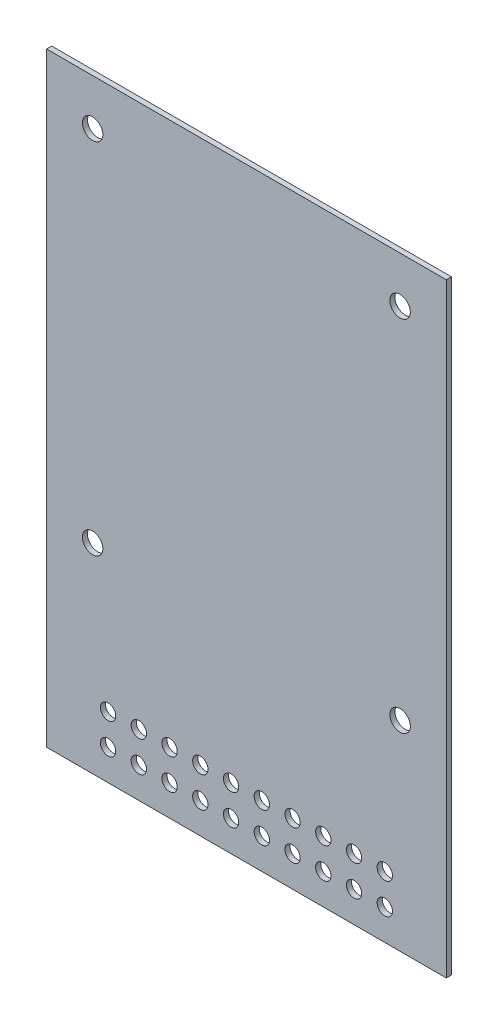
ISO-10303-21;
HEADER;
FILE_DESCRIPTION(('STEP AP214'),'2;1');
FILE_NAME('part.step','',(''),(''),'','','');
FILE_SCHEMA(('AUTOMOTIVE_DESIGN { 1 0 10303 214 1 1 1 1 }'));
ENDSEC;
DATA;
#1=APPLICATION_CONTEXT('core data for automotive mechanical design processes');
#2=APPLICATION_PROTOCOL_DEFINITION('international standard','automotive_design',2000,#1);
#3=PRODUCT_CONTEXT('',#1,'mechanical');
#4=PRODUCT('Part','Part','',(#3));
#5=PRODUCT_RELATED_PRODUCT_CATEGORY('part','',(#4));
#6=PRODUCT_DEFINITION_FORMATION('','',#4);
#7=PRODUCT_DEFINITION_CONTEXT('part definition',#1,'design');
#8=PRODUCT_DEFINITION('design','',#6,#7);
#9=PRODUCT_DEFINITION_SHAPE('','',#8);
#10=(LENGTH_UNIT() NAMED_UNIT(*) SI_UNIT(.MILLI.,.METRE.));
#11=(NAMED_UNIT(*) PLANE_ANGLE_UNIT() SI_UNIT($,.RADIAN.));
#12=(NAMED_UNIT(*) SI_UNIT($,.STERADIAN.) SOLID_ANGLE_UNIT());
#13=UNCERTAINTY_MEASURE_WITH_UNIT(LENGTH_MEASURE(1.E-05),#10,'distance_accuracy_value','');
#14=(GEOMETRIC_REPRESENTATION_CONTEXT(3) GLOBAL_UNCERTAINTY_ASSIGNED_CONTEXT((#13)) GLOBAL_UNIT_ASSIGNED_CONTEXT((#10,
#11,#12)) REPRESENTATION_CONTEXT('',''));
#15=CARTESIAN_POINT('',(0.,0.,0.));
#16=DIRECTION('',(0.,0.,1.));
#17=DIRECTION('',(1.,0.,0.));
#18=AXIS2_PLACEMENT_3D('',#15,#16,#17);
#19=CARTESIAN_POINT('',(0.,0.,1.));
#20=DIRECTION('',(1.,0.,0.));
#21=DIRECTION('',(0.,0.,-1.));
#22=AXIS2_PLACEMENT_3D('',#19,#20,#21);
#23=PLANE('',#22);
#24=DIRECTION('',(0.,-1.,0.));
#25=VECTOR('',#24,1.);
#26=CARTESIAN_POINT('',(0.,0.,0.));
#27=LINE('',#26,#25);
#28=CARTESIAN_POINT('',(0.,118.,0.));
#29=VERTEX_POINT('',#28);
#30=CARTESIAN_POINT('',(0.,0.,0.));
#31=VERTEX_POINT('',#30);
#32=EDGE_CURVE('E95',#29,#31,#27,.T.);
#33=ORIENTED_EDGE('',*,*,#32,.T.);
#34=DIRECTION('',(0.,0.,-1.));
#35=VECTOR('',#34,1.);
#36=CARTESIAN_POINT('',(0.,0.,1.));
#37=LINE('',#36,#35);
#38=CARTESIAN_POINT('',(0.,0.,1.));
#39=VERTEX_POINT('',#38);
#40=EDGE_CURVE('E11',#39,#31,#37,.T.);
#41=ORIENTED_EDGE('',*,*,#40,.F.);
#42=DIRECTION('',(0.,-1.,0.));
#43=VECTOR('',#42,1.);
#44=CARTESIAN_POINT('',(0.,0.,1.));
#45=LINE('',#44,#43);
#46=CARTESIAN_POINT('',(0.,118.,1.));
#47=VERTEX_POINT('',#46);
#48=EDGE_CURVE('E83',#47,#39,#45,.T.);
#49=ORIENTED_EDGE('',*,*,#48,.F.);
#50=DIRECTION('',(0.,0.,-1.));
#51=VECTOR('',#50,1.);
#52=CARTESIAN_POINT('',(0.,118.,1.));
#53=LINE('',#52,#51);
#54=EDGE_CURVE('E91',#47,#29,#53,.T.);
#55=ORIENTED_EDGE('',*,*,#54,.T.);
#56=EDGE_LOOP('',(#33,#41,#49,#55));
#57=FACE_BOUND('',#56,.T.);
#58=ADVANCED_FACE('F32',(#57),#23,.F.);
#59=CARTESIAN_POINT('',(0.,0.,1.));
#60=DIRECTION('',(0.,1.,0.));
#61=DIRECTION('',(0.,0.,1.));
#62=AXIS2_PLACEMENT_3D('',#59,#60,#61);
#63=PLANE('',#62);
#64=DIRECTION('',(1.,0.,0.));
#65=VECTOR('',#64,1.);
#66=CARTESIAN_POINT('',(0.,0.,0.));
#67=LINE('',#66,#65);
#68=CARTESIAN_POINT('',(78.,0.,0.));
#69=VERTEX_POINT('',#68);
#70=EDGE_CURVE('E87',#31,#69,#67,.T.);
#71=ORIENTED_EDGE('',*,*,#70,.T.);
#72=DIRECTION('',(0.,0.,-1.));
#73=VECTOR('',#72,1.);
#74=CARTESIAN_POINT('',(78.,0.,1.));
#75=LINE('',#74,#73);
#76=CARTESIAN_POINT('',(78.,0.,1.));
#77=VERTEX_POINT('',#76);
#78=EDGE_CURVE('E40',#77,#69,#75,.T.);
#79=ORIENTED_EDGE('',*,*,#78,.F.);
#80=DIRECTION('',(1.,0.,0.));
#81=VECTOR('',#80,1.);
#82=CARTESIAN_POINT('',(0.,0.,1.));
#83=LINE('',#82,#81);
#84=EDGE_CURVE('E78',#39,#77,#83,.T.);
#85=ORIENTED_EDGE('',*,*,#84,.F.);
#86=ORIENTED_EDGE('',*,*,#40,.T.);
#87=EDGE_LOOP('',(#71,#79,#85,#86));
#88=FACE_BOUND('',#87,.T.);
#89=ADVANCED_FACE('F86',(#88),#63,.F.);
#90=CARTESIAN_POINT('',(78.,0.,1.));
#91=DIRECTION('',(-1.,0.,0.));
#92=DIRECTION('',(0.,0.,1.));
#93=AXIS2_PLACEMENT_3D('',#90,#91,#92);
#94=PLANE('',#93);
#95=DIRECTION('',(0.,1.,0.));
#96=VECTOR('',#95,1.);
#97=CARTESIAN_POINT('',(78.,0.,0.));
#98=LINE('',#97,#96);
#99=CARTESIAN_POINT('',(78.,118.,0.));
#100=VERTEX_POINT('',#99);
#101=EDGE_CURVE('E65',#69,#100,#98,.T.);
#102=ORIENTED_EDGE('',*,*,#101,.T.);
#103=DIRECTION('',(0.,0.,-1.));
#104=VECTOR('',#103,1.);
#105=CARTESIAN_POINT('',(78.,118.,1.));
#106=LINE('',#105,#104);
#107=CARTESIAN_POINT('',(78.,118.,1.));
#108=VERTEX_POINT('',#107);
#109=EDGE_CURVE('E88',#108,#100,#106,.T.);
#110=ORIENTED_EDGE('',*,*,#109,.F.);
#111=DIRECTION('',(0.,1.,0.));
#112=VECTOR('',#111,1.);
#113=CARTESIAN_POINT('',(78.,0.,1.));
#114=LINE('',#113,#112);
#115=EDGE_CURVE('E81',#77,#108,#114,.T.);
#116=ORIENTED_EDGE('',*,*,#115,.F.);
#117=ORIENTED_EDGE('',*,*,#78,.T.);
#118=EDGE_LOOP('',(#102,#110,#116,#117));
#119=FACE_BOUND('',#118,.T.);
#120=ADVANCED_FACE('F89',(#119),#94,.F.);
#121=CARTESIAN_POINT('',(0.,118.,1.));
#122=DIRECTION('',(0.,-1.,0.));
#123=DIRECTION('',(0.,0.,-1.));
#124=AXIS2_PLACEMENT_3D('',#121,#122,#123);
#125=PLANE('',#124);
#126=DIRECTION('',(-1.,0.,0.));
#127=VECTOR('',#126,1.);
#128=CARTESIAN_POINT('',(0.,118.,0.));
#129=LINE('',#128,#127);
#130=EDGE_CURVE('E71',#100,#29,#129,.T.);
#131=ORIENTED_EDGE('',*,*,#130,.T.);
#132=ORIENTED_EDGE('',*,*,#54,.F.);
#133=DIRECTION('',(-1.,0.,0.));
#134=VECTOR('',#133,1.);
#135=CARTESIAN_POINT('',(0.,118.,1.));
#136=LINE('',#135,#134);
#137=EDGE_CURVE('E48',#108,#47,#136,.T.);
#138=ORIENTED_EDGE('',*,*,#137,.F.);
#139=ORIENTED_EDGE('',*,*,#109,.T.);
#140=EDGE_LOOP('',(#131,#132,#138,#139));
#141=FACE_BOUND('',#140,.T.);
#142=ADVANCED_FACE('F103',(#141),#125,.F.);
#143=CARTESIAN_POINT('',(0.,0.,1.));
#144=DIRECTION('',(0.,0.,-1.));
#145=DIRECTION('',(-1.,0.,0.));
#146=AXIS2_PLACEMENT_3D('',#143,#144,#145);
#147=PLANE('',#146);
#148=CARTESIAN_POINT('',(42.,6.,1.));
#149=DIRECTION('',(0.,0.,-1.));
#150=DIRECTION('',(-1.,0.,0.));
#151=AXIS2_PLACEMENT_3D('',#148,#149,#150);
#152=CIRCLE('',#151,1.5);
#153=CARTESIAN_POINT('',(40.4999999999999,6.,1.));
#154=VERTEX_POINT('',#153);
#155=EDGE_CURVE('E202',#154,#154,#152,.T.);
#156=ORIENTED_EDGE('',*,*,#155,.T.);
#157=EDGE_LOOP('',(#156));
#158=FACE_BOUND('',#157,.T.);
#159=CARTESIAN_POINT('',(47.9999999999999,6.,1.));
#160=DIRECTION('',(0.,0.,-1.));
#161=DIRECTION('',(-1.,0.,0.));
#162=AXIS2_PLACEMENT_3D('',#159,#160,#161);
#163=CIRCLE('',#162,1.5);
#164=CARTESIAN_POINT('',(46.4999999999999,6.,1.));
#165=VERTEX_POINT('',#164);
#166=EDGE_CURVE('E209',#165,#165,#163,.T.);
#167=ORIENTED_EDGE('',*,*,#166,.T.);
#168=EDGE_LOOP('',(#167));
#169=FACE_BOUND('',#168,.T.);
#170=CARTESIAN_POINT('',(53.9999999999999,6.,1.));
#171=DIRECTION('',(0.,0.,-1.));
#172=DIRECTION('',(-1.,0.,0.));
#173=AXIS2_PLACEMENT_3D('',#170,#171,#172);
#174=CIRCLE('',#173,1.50000000000001);
#175=CARTESIAN_POINT('',(52.4999999999999,6.,1.));
#176=VERTEX_POINT('',#175);
#177=EDGE_CURVE('E191',#176,#176,#174,.T.);
#178=ORIENTED_EDGE('',*,*,#177,.T.);
#179=EDGE_LOOP('',(#178));
#180=FACE_BOUND('',#179,.T.);
#181=CARTESIAN_POINT('',(18.,12.,1.));
#182=DIRECTION('',(0.,0.,-1.));
#183=DIRECTION('',(-1.,0.,0.));
#184=AXIS2_PLACEMENT_3D('',#181,#182,#183);
#185=CIRCLE('',#184,1.5);
#186=CARTESIAN_POINT('',(16.5,12.,1.));
#187=VERTEX_POINT('',#186);
#188=EDGE_CURVE('E149',#187,#187,#185,.T.);
#189=ORIENTED_EDGE('',*,*,#188,.T.);
#190=EDGE_LOOP('',(#189));
#191=FACE_BOUND('',#190,.T.);
#192=CARTESIAN_POINT('',(12.,12.,1.));
#193=DIRECTION('',(0.,0.,-1.));
#194=DIRECTION('',(-1.,0.,0.));
#195=AXIS2_PLACEMENT_3D('',#192,#193,#194);
#196=CIRCLE('',#195,1.5);
#197=CARTESIAN_POINT('',(10.5,12.,1.));
#198=VERTEX_POINT('',#197);
#199=EDGE_CURVE('E184',#198,#198,#196,.T.);
#200=ORIENTED_EDGE('',*,*,#199,.T.);
#201=EDGE_LOOP('',(#200));
#202=FACE_BOUND('',#201,.T.);
#203=CARTESIAN_POINT('',(59.9999999999999,6.,1.));
#204=DIRECTION('',(0.,0.,-1.));
#205=DIRECTION('',(-1.,0.,0.));
#206=AXIS2_PLACEMENT_3D('',#203,#204,#205);
#207=CIRCLE('',#206,1.5);
#208=CARTESIAN_POINT('',(58.4999999999999,6.,1.));
#209=VERTEX_POINT('',#208);
#210=EDGE_CURVE('E190',#209,#209,#207,.T.);
#211=ORIENTED_EDGE('',*,*,#210,.T.);
#212=EDGE_LOOP('',(#211));
#213=FACE_BOUND('',#212,.T.);
#214=CARTESIAN_POINT('',(18.,6.,1.));
#215=DIRECTION('',(0.,0.,-1.));
#216=DIRECTION('',(-1.,0.,0.));
#217=AXIS2_PLACEMENT_3D('',#214,#215,#216);
#218=CIRCLE('',#217,1.5);
#219=CARTESIAN_POINT('',(16.5,6.,1.));
#220=VERTEX_POINT('',#219);
#221=EDGE_CURVE('E221',#220,#220,#218,.T.);
#222=ORIENTED_EDGE('',*,*,#221,.T.);
#223=EDGE_LOOP('',(#222));
#224=FACE_BOUND('',#223,.T.);
#225=CARTESIAN_POINT('',(12.,6.,1.));
#226=DIRECTION('',(0.,0.,-1.));
#227=DIRECTION('',(-1.,0.,0.));
#228=AXIS2_PLACEMENT_3D('',#225,#226,#227);
#229=CIRCLE('',#228,1.5);
#230=CARTESIAN_POINT('',(10.5,6.,1.));
#231=VERTEX_POINT('',#230);
#232=EDGE_CURVE('E238',#231,#231,#229,.T.);
#233=ORIENTED_EDGE('',*,*,#232,.T.);
#234=EDGE_LOOP('',(#233));
#235=FACE_BOUND('',#234,.T.);
#236=CARTESIAN_POINT('',(65.9999999999999,6.,1.));
#237=DIRECTION('',(0.,0.,-1.));
#238=DIRECTION('',(-1.,0.,0.));
#239=AXIS2_PLACEMENT_3D('',#236,#237,#238);
#240=CIRCLE('',#239,1.5);
#241=CARTESIAN_POINT('',(64.4999999999999,6.,1.));
#242=VERTEX_POINT('',#241);
#243=EDGE_CURVE('E244',#242,#242,#240,.T.);
#244=ORIENTED_EDGE('',*,*,#243,.T.);
#245=EDGE_LOOP('',(#244));
#246=FACE_BOUND('',#245,.T.);
#247=CARTESIAN_POINT('',(24.,6.,1.));
#248=DIRECTION('',(0.,0.,-1.));
#249=DIRECTION('',(-1.,0.,0.));
#250=AXIS2_PLACEMENT_3D('',#247,#248,#249);
#251=CIRCLE('',#250,1.5);
#252=CARTESIAN_POINT('',(22.4999999999999,6.,1.));
#253=VERTEX_POINT('',#252);
#254=EDGE_CURVE('E220',#253,#253,#251,.T.);
#255=ORIENTED_EDGE('',*,*,#254,.T.);
#256=EDGE_LOOP('',(#255));
#257=FACE_BOUND('',#256,.T.);
#258=CARTESIAN_POINT('',(30.,6.,1.));
#259=DIRECTION('',(0.,0.,-1.));
#260=DIRECTION('',(-1.,0.,0.));
#261=AXIS2_PLACEMENT_3D('',#258,#259,#260);
#262=CIRCLE('',#261,1.5);
#263=CARTESIAN_POINT('',(28.4999999999999,6.,1.));
#264=VERTEX_POINT('',#263);
#265=EDGE_CURVE('E227',#264,#264,#262,.T.);
#266=ORIENTED_EDGE('',*,*,#265,.T.);
#267=EDGE_LOOP('',(#266));
#268=FACE_BOUND('',#267,.T.);
#269=CARTESIAN_POINT('',(36.,6.,1.));
#270=DIRECTION('',(0.,0.,-1.));
#271=DIRECTION('',(-1.,0.,0.));
#272=AXIS2_PLACEMENT_3D('',#269,#270,#271);
#273=CIRCLE('',#272,1.5);
#274=CARTESIAN_POINT('',(34.5,6.,1.));
#275=VERTEX_POINT('',#274);
#276=EDGE_CURVE('E203',#275,#275,#273,.T.);
#277=ORIENTED_EDGE('',*,*,#276,.T.);
#278=EDGE_LOOP('',(#277));
#279=FACE_BOUND('',#278,.T.);
#280=CARTESIAN_POINT('',(60.,12.,1.));
#281=DIRECTION('',(0.,0.,-1.));
#282=DIRECTION('',(-1.,0.,0.));
#283=AXIS2_PLACEMENT_3D('',#280,#281,#282);
#284=CIRCLE('',#283,1.5);
#285=CARTESIAN_POINT('',(58.5,12.,1.));
#286=VERTEX_POINT('',#285);
#287=EDGE_CURVE('E130',#286,#286,#284,.T.);
#288=ORIENTED_EDGE('',*,*,#287,.T.);
#289=EDGE_LOOP('',(#288));
#290=FACE_BOUND('',#289,.T.);
#291=CARTESIAN_POINT('',(8.98039304889869,109.016810722607,1.));
#292=DIRECTION('',(0.,0.,-1.));
#293=DIRECTION('',(-1.,0.,0.));
#294=AXIS2_PLACEMENT_3D('',#291,#292,#293);
#295=CIRCLE('',#294,2.);
#296=CARTESIAN_POINT('',(6.98039304889868,109.016810722607,1.));
#297=VERTEX_POINT('',#296);
#298=EDGE_CURVE('E137',#297,#297,#295,.T.);
#299=ORIENTED_EDGE('',*,*,#298,.T.);
#300=EDGE_LOOP('',(#299));
#301=FACE_BOUND('',#300,.T.);
#302=CARTESIAN_POINT('',(68.9803930488987,109.016810722607,1.));
#303=DIRECTION('',(0.,0.,-1.));
#304=DIRECTION('',(-1.,0.,0.));
#305=AXIS2_PLACEMENT_3D('',#302,#303,#304);
#306=CIRCLE('',#305,2.);
#307=CARTESIAN_POINT('',(66.9803930488987,109.016810722607,1.));
#308=VERTEX_POINT('',#307);
#309=EDGE_CURVE('E119',#308,#308,#306,.T.);
#310=ORIENTED_EDGE('',*,*,#309,.T.);
#311=EDGE_LOOP('',(#310));
#312=FACE_BOUND('',#311,.T.);
#313=CARTESIAN_POINT('',(68.9803930488984,39.0168107226069,1.));
#314=DIRECTION('',(0.,0.,-1.));
#315=DIRECTION('',(-1.,0.,0.));
#316=AXIS2_PLACEMENT_3D('',#313,#314,#315);
#317=CIRCLE('',#316,2.00000000000001);
#318=CARTESIAN_POINT('',(66.9803930488984,39.0168107226069,1.));
#319=VERTEX_POINT('',#318);
#320=EDGE_CURVE('E118',#319,#319,#317,.T.);
#321=ORIENTED_EDGE('',*,*,#320,.T.);
#322=EDGE_LOOP('',(#321));
#323=FACE_BOUND('',#322,.T.);
#324=CARTESIAN_POINT('',(66.,12.,1.));
#325=DIRECTION('',(0.,0.,-1.));
#326=DIRECTION('',(-1.,0.,0.));
#327=AXIS2_PLACEMENT_3D('',#324,#325,#326);
#328=CIRCLE('',#327,1.5);
#329=CARTESIAN_POINT('',(64.5,12.,1.));
#330=VERTEX_POINT('',#329);
#331=EDGE_CURVE('E112',#330,#330,#328,.T.);
#332=ORIENTED_EDGE('',*,*,#331,.T.);
#333=EDGE_LOOP('',(#332));
#334=FACE_BOUND('',#333,.T.);
#335=CARTESIAN_POINT('',(54.,12.,1.));
#336=DIRECTION('',(0.,0.,-1.));
#337=DIRECTION('',(-1.,0.,0.));
#338=AXIS2_PLACEMENT_3D('',#335,#336,#337);
#339=CIRCLE('',#338,1.5);
#340=CARTESIAN_POINT('',(52.5,12.,1.));
#341=VERTEX_POINT('',#340);
#342=EDGE_CURVE('E131',#341,#341,#339,.T.);
#343=ORIENTED_EDGE('',*,*,#342,.T.);
#344=EDGE_LOOP('',(#343));
#345=FACE_BOUND('',#344,.T.);
#346=CARTESIAN_POINT('',(48.,12.,1.));
#347=DIRECTION('',(0.,0.,-1.));
#348=DIRECTION('',(-1.,0.,0.));
#349=AXIS2_PLACEMENT_3D('',#346,#347,#348);
#350=CIRCLE('',#349,1.5);
#351=CARTESIAN_POINT('',(46.5,12.,1.));
#352=VERTEX_POINT('',#351);
#353=EDGE_CURVE('E173',#352,#352,#350,.T.);
#354=ORIENTED_EDGE('',*,*,#353,.T.);
#355=EDGE_LOOP('',(#354));
#356=FACE_BOUND('',#355,.T.);
#357=CARTESIAN_POINT('',(42.,12.,1.));
#358=DIRECTION('',(0.,0.,-1.));
#359=DIRECTION('',(-1.,0.,0.));
#360=AXIS2_PLACEMENT_3D('',#357,#358,#359);
#361=CIRCLE('',#360,1.5);
#362=CARTESIAN_POINT('',(40.5,12.,1.));
#363=VERTEX_POINT('',#362);
#364=EDGE_CURVE('E167',#363,#363,#361,.T.);
#365=ORIENTED_EDGE('',*,*,#364,.T.);
#366=EDGE_LOOP('',(#365));
#367=FACE_BOUND('',#366,.T.);
#368=CARTESIAN_POINT('',(36.,12.,1.));
#369=DIRECTION('',(0.,0.,-1.));
#370=DIRECTION('',(-1.,0.,0.));
#371=AXIS2_PLACEMENT_3D('',#368,#369,#370);
#372=CIRCLE('',#371,1.5);
#373=CARTESIAN_POINT('',(34.5,12.,1.));
#374=VERTEX_POINT('',#373);
#375=EDGE_CURVE('E161',#374,#374,#372,.T.);
#376=ORIENTED_EDGE('',*,*,#375,.T.);
#377=EDGE_LOOP('',(#376));
#378=FACE_BOUND('',#377,.T.);
#379=CARTESIAN_POINT('',(30.,12.,1.));
#380=DIRECTION('',(0.,0.,-1.));
#381=DIRECTION('',(-1.,0.,0.));
#382=AXIS2_PLACEMENT_3D('',#379,#380,#381);
#383=CIRCLE('',#382,1.5);
#384=CARTESIAN_POINT('',(28.5,12.,1.));
#385=VERTEX_POINT('',#384);
#386=EDGE_CURVE('E155',#385,#385,#383,.T.);
#387=ORIENTED_EDGE('',*,*,#386,.T.);
#388=EDGE_LOOP('',(#387));
#389=FACE_BOUND('',#388,.T.);
#390=CARTESIAN_POINT('',(24.,12.,1.));
#391=DIRECTION('',(0.,0.,-1.));
#392=DIRECTION('',(-1.,0.,0.));
#393=AXIS2_PLACEMENT_3D('',#390,#391,#392);
#394=CIRCLE('',#393,1.5);
#395=CARTESIAN_POINT('',(22.5,12.,1.));
#396=VERTEX_POINT('',#395);
#397=EDGE_CURVE('E148',#396,#396,#394,.T.);
#398=ORIENTED_EDGE('',*,*,#397,.T.);
#399=EDGE_LOOP('',(#398));
#400=FACE_BOUND('',#399,.T.);
#401=CARTESIAN_POINT('',(8.98039304889844,39.0168107226073,1.));
#402=DIRECTION('',(0.,0.,-1.));
#403=DIRECTION('',(-1.,0.,0.));
#404=AXIS2_PLACEMENT_3D('',#401,#402,#403);
#405=CIRCLE('',#404,2.);
#406=CARTESIAN_POINT('',(6.98039304889844,39.0168107226073,1.));
#407=VERTEX_POINT('',#406);
#408=EDGE_CURVE('E98',#407,#407,#405,.T.);
#409=ORIENTED_EDGE('',*,*,#408,.T.);
#410=EDGE_LOOP('',(#409));
#411=FACE_BOUND('',#410,.T.);
#412=ORIENTED_EDGE('',*,*,#48,.T.);
#413=ORIENTED_EDGE('',*,*,#84,.T.);
#414=ORIENTED_EDGE('',*,*,#115,.T.);
#415=ORIENTED_EDGE('',*,*,#137,.T.);
#416=EDGE_LOOP('',(#412,#413,#414,#415));
#417=FACE_BOUND('',#416,.T.);
#418=ADVANCED_FACE('F79',(#158,#169,#180,#191,#202,#213,#224,#235,#246,#257,#268,#279,#290,#301,
#312,#323,#334,#345,#356,#367,#378,#389,#400,#411,#417),#147,.F.);
#419=CARTESIAN_POINT('',(0.,0.,0.));
#420=DIRECTION('',(0.,0.,-1.));
#421=DIRECTION('',(-1.,0.,0.));
#422=AXIS2_PLACEMENT_3D('',#419,#420,#421);
#423=PLANE('',#422);
#424=CARTESIAN_POINT('',(42.,6.,0.));
#425=DIRECTION('',(0.,0.,-1.));
#426=DIRECTION('',(-1.,0.,0.));
#427=AXIS2_PLACEMENT_3D('',#424,#425,#426);
#428=CIRCLE('',#427,1.5);
#429=CARTESIAN_POINT('',(40.4999999999999,6.,0.));
#430=VERTEX_POINT('',#429);
#431=EDGE_CURVE('E199',#430,#430,#428,.T.);
#432=ORIENTED_EDGE('',*,*,#431,.F.);
#433=EDGE_LOOP('',(#432));
#434=FACE_BOUND('',#433,.T.);
#435=CARTESIAN_POINT('',(47.9999999999999,6.,0.));
#436=DIRECTION('',(0.,0.,-1.));
#437=DIRECTION('',(-1.,0.,0.));
#438=AXIS2_PLACEMENT_3D('',#435,#436,#437);
#439=CIRCLE('',#438,1.5);
#440=CARTESIAN_POINT('',(46.4999999999999,6.,0.));
#441=VERTEX_POINT('',#440);
#442=EDGE_CURVE('E206',#441,#441,#439,.T.);
#443=ORIENTED_EDGE('',*,*,#442,.F.);
#444=EDGE_LOOP('',(#443));
#445=FACE_BOUND('',#444,.T.);
#446=CARTESIAN_POINT('',(53.9999999999999,6.,0.));
#447=DIRECTION('',(0.,0.,-1.));
#448=DIRECTION('',(-1.,0.,0.));
#449=AXIS2_PLACEMENT_3D('',#446,#447,#448);
#450=CIRCLE('',#449,1.50000000000001);
#451=CARTESIAN_POINT('',(52.4999999999999,6.,0.));
#452=VERTEX_POINT('',#451);
#453=EDGE_CURVE('E212',#452,#452,#450,.T.);
#454=ORIENTED_EDGE('',*,*,#453,.F.);
#455=EDGE_LOOP('',(#454));
#456=FACE_BOUND('',#455,.T.);
#457=CARTESIAN_POINT('',(18.,12.,0.));
#458=DIRECTION('',(0.,0.,-1.));
#459=DIRECTION('',(-1.,0.,0.));
#460=AXIS2_PLACEMENT_3D('',#457,#458,#459);
#461=CIRCLE('',#460,1.5);
#462=CARTESIAN_POINT('',(16.5,12.,0.));
#463=VERTEX_POINT('',#462);
#464=EDGE_CURVE('E181',#463,#463,#461,.T.);
#465=ORIENTED_EDGE('',*,*,#464,.F.);
#466=EDGE_LOOP('',(#465));
#467=FACE_BOUND('',#466,.T.);
#468=CARTESIAN_POINT('',(12.,12.,0.));
#469=DIRECTION('',(0.,0.,-1.));
#470=DIRECTION('',(-1.,0.,0.));
#471=AXIS2_PLACEMENT_3D('',#468,#469,#470);
#472=CIRCLE('',#471,1.5);
#473=CARTESIAN_POINT('',(10.5,12.,0.));
#474=VERTEX_POINT('',#473);
#475=EDGE_CURVE('E194',#474,#474,#472,.T.);
#476=ORIENTED_EDGE('',*,*,#475,.F.);
#477=EDGE_LOOP('',(#476));
#478=FACE_BOUND('',#477,.T.);
#479=CARTESIAN_POINT('',(59.9999999999999,6.,0.));
#480=DIRECTION('',(0.,0.,-1.));
#481=DIRECTION('',(-1.,0.,0.));
#482=AXIS2_PLACEMENT_3D('',#479,#480,#481);
#483=CIRCLE('',#482,1.5);
#484=CARTESIAN_POINT('',(58.4999999999999,6.,0.));
#485=VERTEX_POINT('',#484);
#486=EDGE_CURVE('E187',#485,#485,#483,.T.);
#487=ORIENTED_EDGE('',*,*,#486,.F.);
#488=EDGE_LOOP('',(#487));
#489=FACE_BOUND('',#488,.T.);
#490=CARTESIAN_POINT('',(18.,6.,0.));
#491=DIRECTION('',(0.,0.,-1.));
#492=DIRECTION('',(-1.,0.,0.));
#493=AXIS2_PLACEMENT_3D('',#490,#491,#492);
#494=CIRCLE('',#493,1.5);
#495=CARTESIAN_POINT('',(16.5,6.,0.));
#496=VERTEX_POINT('',#495);
#497=EDGE_CURVE('E235',#496,#496,#494,.T.);
#498=ORIENTED_EDGE('',*,*,#497,.F.);
#499=EDGE_LOOP('',(#498));
#500=FACE_BOUND('',#499,.T.);
#501=CARTESIAN_POINT('',(12.,6.,0.));
#502=DIRECTION('',(0.,0.,-1.));
#503=DIRECTION('',(-1.,0.,0.));
#504=AXIS2_PLACEMENT_3D('',#501,#502,#503);
#505=CIRCLE('',#504,1.5);
#506=CARTESIAN_POINT('',(10.5,6.,0.));
#507=VERTEX_POINT('',#506);
#508=EDGE_CURVE('E247',#507,#507,#505,.T.);
#509=ORIENTED_EDGE('',*,*,#508,.F.);
#510=EDGE_LOOP('',(#509));
#511=FACE_BOUND('',#510,.T.);
#512=CARTESIAN_POINT('',(65.9999999999999,6.,0.));
#513=DIRECTION('',(0.,0.,-1.));
#514=DIRECTION('',(-1.,0.,0.));
#515=AXIS2_PLACEMENT_3D('',#512,#513,#514);
#516=CIRCLE('',#515,1.5);
#517=CARTESIAN_POINT('',(64.4999999999999,6.,0.));
#518=VERTEX_POINT('',#517);
#519=EDGE_CURVE('E241',#518,#518,#516,.T.);
#520=ORIENTED_EDGE('',*,*,#519,.F.);
#521=EDGE_LOOP('',(#520));
#522=FACE_BOUND('',#521,.T.);
#523=CARTESIAN_POINT('',(24.,6.,0.));
#524=DIRECTION('',(0.,0.,-1.));
#525=DIRECTION('',(-1.,0.,0.));
#526=AXIS2_PLACEMENT_3D('',#523,#524,#525);
#527=CIRCLE('',#526,1.5);
#528=CARTESIAN_POINT('',(22.4999999999999,6.,0.));
#529=VERTEX_POINT('',#528);
#530=EDGE_CURVE('E217',#529,#529,#527,.T.);
#531=ORIENTED_EDGE('',*,*,#530,.F.);
#532=EDGE_LOOP('',(#531));
#533=FACE_BOUND('',#532,.T.);
#534=CARTESIAN_POINT('',(30.,6.,0.));
#535=DIRECTION('',(0.,0.,-1.));
#536=DIRECTION('',(-1.,0.,0.));
#537=AXIS2_PLACEMENT_3D('',#534,#535,#536);
#538=CIRCLE('',#537,1.5);
#539=CARTESIAN_POINT('',(28.4999999999999,6.,0.));
#540=VERTEX_POINT('',#539);
#541=EDGE_CURVE('E224',#540,#540,#538,.T.);
#542=ORIENTED_EDGE('',*,*,#541,.F.);
#543=EDGE_LOOP('',(#542));
#544=FACE_BOUND('',#543,.T.);
#545=CARTESIAN_POINT('',(36.,6.,0.));
#546=DIRECTION('',(0.,0.,-1.));
#547=DIRECTION('',(-1.,0.,0.));
#548=AXIS2_PLACEMENT_3D('',#545,#546,#547);
#549=CIRCLE('',#548,1.5);
#550=CARTESIAN_POINT('',(34.5,6.,0.));
#551=VERTEX_POINT('',#550);
#552=EDGE_CURVE('E230',#551,#551,#549,.T.);
#553=ORIENTED_EDGE('',*,*,#552,.F.);
#554=EDGE_LOOP('',(#553));
#555=FACE_BOUND('',#554,.T.);
#556=CARTESIAN_POINT('',(60.,12.,0.));
#557=DIRECTION('',(0.,0.,-1.));
#558=DIRECTION('',(-1.,0.,0.));
#559=AXIS2_PLACEMENT_3D('',#556,#557,#558);
#560=CIRCLE('',#559,1.5);
#561=CARTESIAN_POINT('',(58.5,12.,0.));
#562=VERTEX_POINT('',#561);
#563=EDGE_CURVE('E127',#562,#562,#560,.T.);
#564=ORIENTED_EDGE('',*,*,#563,.F.);
#565=EDGE_LOOP('',(#564));
#566=FACE_BOUND('',#565,.T.);
#567=CARTESIAN_POINT('',(8.98039304889869,109.016810722607,0.));
#568=DIRECTION('',(0.,0.,-1.));
#569=DIRECTION('',(-1.,0.,0.));
#570=AXIS2_PLACEMENT_3D('',#567,#568,#569);
#571=CIRCLE('',#570,2.);
#572=CARTESIAN_POINT('',(6.98039304889868,109.016810722607,0.));
#573=VERTEX_POINT('',#572);
#574=EDGE_CURVE('E134',#573,#573,#571,.T.);
#575=ORIENTED_EDGE('',*,*,#574,.F.);
#576=EDGE_LOOP('',(#575));
#577=FACE_BOUND('',#576,.T.);
#578=CARTESIAN_POINT('',(68.9803930488987,109.016810722607,0.));
#579=DIRECTION('',(0.,0.,-1.));
#580=DIRECTION('',(-1.,0.,0.));
#581=AXIS2_PLACEMENT_3D('',#578,#579,#580);
#582=CIRCLE('',#581,2.);
#583=CARTESIAN_POINT('',(66.9803930488987,109.016810722607,0.));
#584=VERTEX_POINT('',#583);
#585=EDGE_CURVE('E140',#584,#584,#582,.T.);
#586=ORIENTED_EDGE('',*,*,#585,.F.);
#587=EDGE_LOOP('',(#586));
#588=FACE_BOUND('',#587,.T.);
#589=CARTESIAN_POINT('',(68.9803930488984,39.0168107226069,0.));
#590=DIRECTION('',(0.,0.,-1.));
#591=DIRECTION('',(-1.,0.,0.));
#592=AXIS2_PLACEMENT_3D('',#589,#590,#591);
#593=CIRCLE('',#592,2.00000000000001);
#594=CARTESIAN_POINT('',(66.9803930488984,39.0168107226069,0.));
#595=VERTEX_POINT('',#594);
#596=EDGE_CURVE('E115',#595,#595,#593,.T.);
#597=ORIENTED_EDGE('',*,*,#596,.F.);
#598=EDGE_LOOP('',(#597));
#599=FACE_BOUND('',#598,.T.);
#600=CARTESIAN_POINT('',(66.,12.,0.));
#601=DIRECTION('',(0.,0.,-1.));
#602=DIRECTION('',(-1.,0.,0.));
#603=AXIS2_PLACEMENT_3D('',#600,#601,#602);
#604=CIRCLE('',#603,1.5);
#605=CARTESIAN_POINT('',(64.5,12.,0.));
#606=VERTEX_POINT('',#605);
#607=EDGE_CURVE('E122',#606,#606,#604,.T.);
#608=ORIENTED_EDGE('',*,*,#607,.F.);
#609=EDGE_LOOP('',(#608));
#610=FACE_BOUND('',#609,.T.);
#611=CARTESIAN_POINT('',(54.,12.,0.));
#612=DIRECTION('',(0.,0.,-1.));
#613=DIRECTION('',(-1.,0.,0.));
#614=AXIS2_PLACEMENT_3D('',#611,#612,#613);
#615=CIRCLE('',#614,1.5);
#616=CARTESIAN_POINT('',(52.5,12.,0.));
#617=VERTEX_POINT('',#616);
#618=EDGE_CURVE('E176',#617,#617,#615,.T.);
#619=ORIENTED_EDGE('',*,*,#618,.F.);
#620=EDGE_LOOP('',(#619));
#621=FACE_BOUND('',#620,.T.);
#622=CARTESIAN_POINT('',(48.,12.,0.));
#623=DIRECTION('',(0.,0.,-1.));
#624=DIRECTION('',(-1.,0.,0.));
#625=AXIS2_PLACEMENT_3D('',#622,#623,#624);
#626=CIRCLE('',#625,1.5);
#627=CARTESIAN_POINT('',(46.5,12.,0.));
#628=VERTEX_POINT('',#627);
#629=EDGE_CURVE('E170',#628,#628,#626,.T.);
#630=ORIENTED_EDGE('',*,*,#629,.F.);
#631=EDGE_LOOP('',(#630));
#632=FACE_BOUND('',#631,.T.);
#633=CARTESIAN_POINT('',(42.,12.,0.));
#634=DIRECTION('',(0.,0.,-1.));
#635=DIRECTION('',(-1.,0.,0.));
#636=AXIS2_PLACEMENT_3D('',#633,#634,#635);
#637=CIRCLE('',#636,1.5);
#638=CARTESIAN_POINT('',(40.5,12.,0.));
#639=VERTEX_POINT('',#638);
#640=EDGE_CURVE('E164',#639,#639,#637,.T.);
#641=ORIENTED_EDGE('',*,*,#640,.F.);
#642=EDGE_LOOP('',(#641));
#643=FACE_BOUND('',#642,.T.);
#644=CARTESIAN_POINT('',(36.,12.,0.));
#645=DIRECTION('',(0.,0.,-1.));
#646=DIRECTION('',(-1.,0.,0.));
#647=AXIS2_PLACEMENT_3D('',#644,#645,#646);
#648=CIRCLE('',#647,1.5);
#649=CARTESIAN_POINT('',(34.5,12.,0.));
#650=VERTEX_POINT('',#649);
#651=EDGE_CURVE('E158',#650,#650,#648,.T.);
#652=ORIENTED_EDGE('',*,*,#651,.F.);
#653=EDGE_LOOP('',(#652));
#654=FACE_BOUND('',#653,.T.);
#655=CARTESIAN_POINT('',(30.,12.,0.));
#656=DIRECTION('',(0.,0.,-1.));
#657=DIRECTION('',(-1.,0.,0.));
#658=AXIS2_PLACEMENT_3D('',#655,#656,#657);
#659=CIRCLE('',#658,1.5);
#660=CARTESIAN_POINT('',(28.5,12.,0.));
#661=VERTEX_POINT('',#660);
#662=EDGE_CURVE('E152',#661,#661,#659,.T.);
#663=ORIENTED_EDGE('',*,*,#662,.F.);
#664=EDGE_LOOP('',(#663));
#665=FACE_BOUND('',#664,.T.);
#666=CARTESIAN_POINT('',(24.,12.,0.));
#667=DIRECTION('',(0.,0.,-1.));
#668=DIRECTION('',(-1.,0.,0.));
#669=AXIS2_PLACEMENT_3D('',#666,#667,#668);
#670=CIRCLE('',#669,1.5);
#671=CARTESIAN_POINT('',(22.5,12.,0.));
#672=VERTEX_POINT('',#671);
#673=EDGE_CURVE('E145',#672,#672,#670,.T.);
#674=ORIENTED_EDGE('',*,*,#673,.F.);
#675=EDGE_LOOP('',(#674));
#676=FACE_BOUND('',#675,.T.);
#677=CARTESIAN_POINT('',(8.98039304889844,39.0168107226073,0.));
#678=DIRECTION('',(0.,0.,-1.));
#679=DIRECTION('',(-1.,0.,0.));
#680=AXIS2_PLACEMENT_3D('',#677,#678,#679);
#681=CIRCLE('',#680,2.);
#682=CARTESIAN_POINT('',(6.98039304889844,39.0168107226073,0.));
#683=VERTEX_POINT('',#682);
#684=EDGE_CURVE('E109',#683,#683,#681,.T.);
#685=ORIENTED_EDGE('',*,*,#684,.F.);
#686=EDGE_LOOP('',(#685));
#687=FACE_BOUND('',#686,.T.);
#688=ORIENTED_EDGE('',*,*,#32,.F.);
#689=ORIENTED_EDGE('',*,*,#130,.F.);
#690=ORIENTED_EDGE('',*,*,#101,.F.);
#691=ORIENTED_EDGE('',*,*,#70,.F.);
#692=EDGE_LOOP('',(#688,#689,#690,#691));
#693=FACE_BOUND('',#692,.T.);
#694=ADVANCED_FACE('F106',(#434,#445,#456,#467,#478,#489,#500,#511,#522,#533,#544,#555,#566,
#577,#588,#599,#610,#621,#632,#643,#654,#665,#676,#687,#693),#423,.T.);
#695=CARTESIAN_POINT('',(8.98039304889844,39.0168107226073,1.));
#696=DIRECTION('',(0.,0.,-1.));
#697=DIRECTION('',(-1.,0.,0.));
#698=AXIS2_PLACEMENT_3D('',#695,#696,#697);
#699=CYLINDRICAL_SURFACE('',#698,2.);
#700=ORIENTED_EDGE('',*,*,#408,.F.);
#701=EDGE_LOOP('',(#700));
#702=FACE_BOUND('',#701,.T.);
#703=ORIENTED_EDGE('',*,*,#684,.T.);
#704=EDGE_LOOP('',(#703));
#705=FACE_BOUND('',#704,.T.);
#706=ADVANCED_FACE('F265',(#702,#705),#699,.F.);
#707=CARTESIAN_POINT('',(24.,12.,1.));
#708=DIRECTION('',(0.,0.,-1.));
#709=DIRECTION('',(-1.,0.,0.));
#710=AXIS2_PLACEMENT_3D('',#707,#708,#709);
#711=CYLINDRICAL_SURFACE('',#710,1.5);
#712=ORIENTED_EDGE('',*,*,#397,.F.);
#713=EDGE_LOOP('',(#712));
#714=FACE_BOUND('',#713,.T.);
#715=ORIENTED_EDGE('',*,*,#673,.T.);
#716=EDGE_LOOP('',(#715));
#717=FACE_BOUND('',#716,.T.);
#718=ADVANCED_FACE('F301',(#714,#717),#711,.F.);
#719=CARTESIAN_POINT('',(30.,12.,1.));
#720=DIRECTION('',(0.,0.,-1.));
#721=DIRECTION('',(-1.,0.,0.));
#722=AXIS2_PLACEMENT_3D('',#719,#720,#721);
#723=CYLINDRICAL_SURFACE('',#722,1.5);
#724=ORIENTED_EDGE('',*,*,#386,.F.);
#725=EDGE_LOOP('',(#724));
#726=FACE_BOUND('',#725,.T.);
#727=ORIENTED_EDGE('',*,*,#662,.T.);
#728=EDGE_LOOP('',(#727));
#729=FACE_BOUND('',#728,.T.);
#730=ADVANCED_FACE('F308',(#726,#729),#723,.F.);
#731=CARTESIAN_POINT('',(36.,12.,1.));
#732=DIRECTION('',(0.,0.,-1.));
#733=DIRECTION('',(-1.,0.,0.));
#734=AXIS2_PLACEMENT_3D('',#731,#732,#733);
#735=CYLINDRICAL_SURFACE('',#734,1.5);
#736=ORIENTED_EDGE('',*,*,#375,.F.);
#737=EDGE_LOOP('',(#736));
#738=FACE_BOUND('',#737,.T.);
#739=ORIENTED_EDGE('',*,*,#651,.T.);
#740=EDGE_LOOP('',(#739));
#741=FACE_BOUND('',#740,.T.);
#742=ADVANCED_FACE('F401',(#738,#741),#735,.F.);
#743=CARTESIAN_POINT('',(42.,12.,1.));
#744=DIRECTION('',(0.,0.,-1.));
#745=DIRECTION('',(-1.,0.,0.));
#746=AXIS2_PLACEMENT_3D('',#743,#744,#745);
#747=CYLINDRICAL_SURFACE('',#746,1.5);
#748=ORIENTED_EDGE('',*,*,#364,.F.);
#749=EDGE_LOOP('',(#748));
#750=FACE_BOUND('',#749,.T.);
#751=ORIENTED_EDGE('',*,*,#640,.T.);
#752=EDGE_LOOP('',(#751));
#753=FACE_BOUND('',#752,.T.);
#754=ADVANCED_FACE('F397',(#750,#753),#747,.F.);
#755=CARTESIAN_POINT('',(48.,12.,1.));
#756=DIRECTION('',(0.,0.,-1.));
#757=DIRECTION('',(-1.,0.,0.));
#758=AXIS2_PLACEMENT_3D('',#755,#756,#757);
#759=CYLINDRICAL_SURFACE('',#758,1.5);
#760=ORIENTED_EDGE('',*,*,#353,.F.);
#761=EDGE_LOOP('',(#760));
#762=FACE_BOUND('',#761,.T.);
#763=ORIENTED_EDGE('',*,*,#629,.T.);
#764=EDGE_LOOP('',(#763));
#765=FACE_BOUND('',#764,.T.);
#766=ADVANCED_FACE('F393',(#762,#765),#759,.F.);
#767=CARTESIAN_POINT('',(54.,12.,1.));
#768=DIRECTION('',(0.,0.,-1.));
#769=DIRECTION('',(-1.,0.,0.));
#770=AXIS2_PLACEMENT_3D('',#767,#768,#769);
#771=CYLINDRICAL_SURFACE('',#770,1.5);
#772=ORIENTED_EDGE('',*,*,#342,.F.);
#773=EDGE_LOOP('',(#772));
#774=FACE_BOUND('',#773,.T.);
#775=ORIENTED_EDGE('',*,*,#618,.T.);
#776=EDGE_LOOP('',(#775));
#777=FACE_BOUND('',#776,.T.);
#778=ADVANCED_FACE('F389',(#774,#777),#771,.F.);
#779=CARTESIAN_POINT('',(66.,12.,1.));
#780=DIRECTION('',(0.,0.,-1.));
#781=DIRECTION('',(-1.,0.,0.));
#782=AXIS2_PLACEMENT_3D('',#779,#780,#781);
#783=CYLINDRICAL_SURFACE('',#782,1.5);
#784=ORIENTED_EDGE('',*,*,#331,.F.);
#785=EDGE_LOOP('',(#784));
#786=FACE_BOUND('',#785,.T.);
#787=ORIENTED_EDGE('',*,*,#607,.T.);
#788=EDGE_LOOP('',(#787));
#789=FACE_BOUND('',#788,.T.);
#790=ADVANCED_FACE('F392',(#786,#789),#783,.F.);
#791=CARTESIAN_POINT('',(68.9803930488984,39.0168107226069,1.));
#792=DIRECTION('',(0.,0.,-1.));
#793=DIRECTION('',(-1.,0.,0.));
#794=AXIS2_PLACEMENT_3D('',#791,#792,#793);
#795=CYLINDRICAL_SURFACE('',#794,2.00000000000001);
#796=ORIENTED_EDGE('',*,*,#320,.F.);
#797=EDGE_LOOP('',(#796));
#798=FACE_BOUND('',#797,.T.);
#799=ORIENTED_EDGE('',*,*,#596,.T.);
#800=EDGE_LOOP('',(#799));
#801=FACE_BOUND('',#800,.T.);
#802=ADVANCED_FACE('F413',(#798,#801),#795,.F.);
#803=CARTESIAN_POINT('',(68.9803930488987,109.016810722607,1.));
#804=DIRECTION('',(0.,0.,-1.));
#805=DIRECTION('',(-1.,0.,0.));
#806=AXIS2_PLACEMENT_3D('',#803,#804,#805);
#807=CYLINDRICAL_SURFACE('',#806,2.);
#808=ORIENTED_EDGE('',*,*,#309,.F.);
#809=EDGE_LOOP('',(#808));
#810=FACE_BOUND('',#809,.T.);
#811=ORIENTED_EDGE('',*,*,#585,.T.);
#812=EDGE_LOOP('',(#811));
#813=FACE_BOUND('',#812,.T.);
#814=ADVANCED_FACE('F409',(#810,#813),#807,.F.);
#815=CARTESIAN_POINT('',(8.98039304889869,109.016810722607,1.));
#816=DIRECTION('',(0.,0.,-1.));
#817=DIRECTION('',(-1.,0.,0.));
#818=AXIS2_PLACEMENT_3D('',#815,#816,#817);
#819=CYLINDRICAL_SURFACE('',#818,2.);
#820=ORIENTED_EDGE('',*,*,#298,.F.);
#821=EDGE_LOOP('',(#820));
#822=FACE_BOUND('',#821,.T.);
#823=ORIENTED_EDGE('',*,*,#574,.T.);
#824=EDGE_LOOP('',(#823));
#825=FACE_BOUND('',#824,.T.);
#826=ADVANCED_FACE('F412',(#822,#825),#819,.F.);
#827=CARTESIAN_POINT('',(60.,12.,1.));
#828=DIRECTION('',(0.,0.,-1.));
#829=DIRECTION('',(-1.,0.,0.));
#830=AXIS2_PLACEMENT_3D('',#827,#828,#829);
#831=CYLINDRICAL_SURFACE('',#830,1.5);
#832=ORIENTED_EDGE('',*,*,#287,.F.);
#833=EDGE_LOOP('',(#832));
#834=FACE_BOUND('',#833,.T.);
#835=ORIENTED_EDGE('',*,*,#563,.T.);
#836=EDGE_LOOP('',(#835));
#837=FACE_BOUND('',#836,.T.);
#838=ADVANCED_FACE('F361',(#834,#837),#831,.F.);
#839=CARTESIAN_POINT('',(36.,6.,1.));
#840=DIRECTION('',(0.,0.,-1.));
#841=DIRECTION('',(-1.,0.,0.));
#842=AXIS2_PLACEMENT_3D('',#839,#840,#841);
#843=CYLINDRICAL_SURFACE('',#842,1.5);
#844=ORIENTED_EDGE('',*,*,#276,.F.);
#845=EDGE_LOOP('',(#844));
#846=FACE_BOUND('',#845,.T.);
#847=ORIENTED_EDGE('',*,*,#552,.T.);
#848=EDGE_LOOP('',(#847));
#849=FACE_BOUND('',#848,.T.);
#850=ADVANCED_FACE('F357',(#846,#849),#843,.F.);
#851=CARTESIAN_POINT('',(30.,6.,1.));
#852=DIRECTION('',(0.,0.,-1.));
#853=DIRECTION('',(-1.,0.,0.));
#854=AXIS2_PLACEMENT_3D('',#851,#852,#853);
#855=CYLINDRICAL_SURFACE('',#854,1.5);
#856=ORIENTED_EDGE('',*,*,#265,.F.);
#857=EDGE_LOOP('',(#856));
#858=FACE_BOUND('',#857,.T.);
#859=ORIENTED_EDGE('',*,*,#541,.T.);
#860=EDGE_LOOP('',(#859));
#861=FACE_BOUND('',#860,.T.);
#862=ADVANCED_FACE('F360',(#858,#861),#855,.F.);
#863=CARTESIAN_POINT('',(24.,6.,1.));
#864=DIRECTION('',(0.,0.,-1.));
#865=DIRECTION('',(-1.,0.,0.));
#866=AXIS2_PLACEMENT_3D('',#863,#864,#865);
#867=CYLINDRICAL_SURFACE('',#866,1.5);
#868=ORIENTED_EDGE('',*,*,#254,.F.);
#869=EDGE_LOOP('',(#868));
#870=FACE_BOUND('',#869,.T.);
#871=ORIENTED_EDGE('',*,*,#530,.T.);
#872=EDGE_LOOP('',(#871));
#873=FACE_BOUND('',#872,.T.);
#874=ADVANCED_FACE('F365',(#870,#873),#867,.F.);
#875=CARTESIAN_POINT('',(65.9999999999999,6.,1.));
#876=DIRECTION('',(0.,0.,-1.));
#877=DIRECTION('',(-1.,0.,0.));
#878=AXIS2_PLACEMENT_3D('',#875,#876,#877);
#879=CYLINDRICAL_SURFACE('',#878,1.5);
#880=ORIENTED_EDGE('',*,*,#243,.F.);
#881=EDGE_LOOP('',(#880));
#882=FACE_BOUND('',#881,.T.);
#883=ORIENTED_EDGE('',*,*,#519,.T.);
#884=EDGE_LOOP('',(#883));
#885=FACE_BOUND('',#884,.T.);
#886=ADVANCED_FACE('F259',(#882,#885),#879,.F.);
#887=CARTESIAN_POINT('',(12.,6.,1.));
#888=DIRECTION('',(0.,0.,-1.));
#889=DIRECTION('',(-1.,0.,0.));
#890=AXIS2_PLACEMENT_3D('',#887,#888,#889);
#891=CYLINDRICAL_SURFACE('',#890,1.5);
#892=ORIENTED_EDGE('',*,*,#232,.F.);
#893=EDGE_LOOP('',(#892));
#894=FACE_BOUND('',#893,.T.);
#895=ORIENTED_EDGE('',*,*,#508,.T.);
#896=EDGE_LOOP('',(#895));
#897=FACE_BOUND('',#896,.T.);
#898=ADVANCED_FACE('F255',(#894,#897),#891,.F.);
#899=CARTESIAN_POINT('',(18.,6.,1.));
#900=DIRECTION('',(0.,0.,-1.));
#901=DIRECTION('',(-1.,0.,0.));
#902=AXIS2_PLACEMENT_3D('',#899,#900,#901);
#903=CYLINDRICAL_SURFACE('',#902,1.5);
#904=ORIENTED_EDGE('',*,*,#221,.F.);
#905=EDGE_LOOP('',(#904));
#906=FACE_BOUND('',#905,.T.);
#907=ORIENTED_EDGE('',*,*,#497,.T.);
#908=EDGE_LOOP('',(#907));
#909=FACE_BOUND('',#908,.T.);
#910=ADVANCED_FACE('F258',(#906,#909),#903,.F.);
#911=CARTESIAN_POINT('',(59.9999999999999,6.,1.));
#912=DIRECTION('',(0.,0.,-1.));
#913=DIRECTION('',(-1.,0.,0.));
#914=AXIS2_PLACEMENT_3D('',#911,#912,#913);
#915=CYLINDRICAL_SURFACE('',#914,1.5);
#916=ORIENTED_EDGE('',*,*,#210,.F.);
#917=EDGE_LOOP('',(#916));
#918=FACE_BOUND('',#917,.T.);
#919=ORIENTED_EDGE('',*,*,#486,.T.);
#920=EDGE_LOOP('',(#919));
#921=FACE_BOUND('',#920,.T.);
#922=ADVANCED_FACE('F345',(#918,#921),#915,.F.);
#923=CARTESIAN_POINT('',(12.,12.,1.));
#924=DIRECTION('',(0.,0.,-1.));
#925=DIRECTION('',(-1.,0.,0.));
#926=AXIS2_PLACEMENT_3D('',#923,#924,#925);
#927=CYLINDRICAL_SURFACE('',#926,1.5);
#928=ORIENTED_EDGE('',*,*,#199,.F.);
#929=EDGE_LOOP('',(#928));
#930=FACE_BOUND('',#929,.T.);
#931=ORIENTED_EDGE('',*,*,#475,.T.);
#932=EDGE_LOOP('',(#931));
#933=FACE_BOUND('',#932,.T.);
#934=ADVANCED_FACE('F352',(#930,#933),#927,.F.);
#935=CARTESIAN_POINT('',(18.,12.,1.));
#936=DIRECTION('',(0.,0.,-1.));
#937=DIRECTION('',(-1.,0.,0.));
#938=AXIS2_PLACEMENT_3D('',#935,#936,#937);
#939=CYLINDRICAL_SURFACE('',#938,1.5);
#940=ORIENTED_EDGE('',*,*,#188,.F.);
#941=EDGE_LOOP('',(#940));
#942=FACE_BOUND('',#941,.T.);
#943=ORIENTED_EDGE('',*,*,#464,.T.);
#944=EDGE_LOOP('',(#943));
#945=FACE_BOUND('',#944,.T.);
#946=ADVANCED_FACE('F374',(#942,#945),#939,.F.);
#947=CARTESIAN_POINT('',(53.9999999999999,6.,1.));
#948=DIRECTION('',(0.,0.,-1.));
#949=DIRECTION('',(-1.,0.,0.));
#950=AXIS2_PLACEMENT_3D('',#947,#948,#949);
#951=CYLINDRICAL_SURFACE('',#950,1.50000000000001);
#952=ORIENTED_EDGE('',*,*,#177,.F.);
#953=EDGE_LOOP('',(#952));
#954=FACE_BOUND('',#953,.T.);
#955=ORIENTED_EDGE('',*,*,#453,.T.);
#956=EDGE_LOOP('',(#955));
#957=FACE_BOUND('',#956,.T.);
#958=ADVANCED_FACE('F370',(#954,#957),#951,.F.);
#959=CARTESIAN_POINT('',(47.9999999999999,6.,1.));
#960=DIRECTION('',(0.,0.,-1.));
#961=DIRECTION('',(-1.,0.,0.));
#962=AXIS2_PLACEMENT_3D('',#959,#960,#961);
#963=CYLINDRICAL_SURFACE('',#962,1.5);
#964=ORIENTED_EDGE('',*,*,#166,.F.);
#965=EDGE_LOOP('',(#964));
#966=FACE_BOUND('',#965,.T.);
#967=ORIENTED_EDGE('',*,*,#442,.T.);
#968=EDGE_LOOP('',(#967));
#969=FACE_BOUND('',#968,.T.);
#970=ADVANCED_FACE('F373',(#966,#969),#963,.F.);
#971=CARTESIAN_POINT('',(42.,6.,1.));
#972=DIRECTION('',(0.,0.,-1.));
#973=DIRECTION('',(-1.,0.,0.));
#974=AXIS2_PLACEMENT_3D('',#971,#972,#973);
#975=CYLINDRICAL_SURFACE('',#974,1.5);
#976=ORIENTED_EDGE('',*,*,#155,.F.);
#977=EDGE_LOOP('',(#976));
#978=FACE_BOUND('',#977,.T.);
#979=ORIENTED_EDGE('',*,*,#431,.T.);
#980=EDGE_LOOP('',(#979));
#981=FACE_BOUND('',#980,.T.);
#982=ADVANCED_FACE('F378',(#978,#981),#975,.F.);
#983=CLOSED_SHELL('',(#58,#89,#120,#142,#418,#694,#706,#718,#730,#742,#754,#766,#778,#790,#802,
#814,#826,#838,#850,#862,#874,#886,#898,#910,#922,#934,#946,#958,#970,#982));
#984=MANIFOLD_SOLID_BREP('B2',#983);
#985=ADVANCED_BREP_SHAPE_REPRESENTATION('',(#18,#984),#14);
#986=SHAPE_DEFINITION_REPRESENTATION(#9,#985);
ENDSEC;
END-ISO-10303-21;
